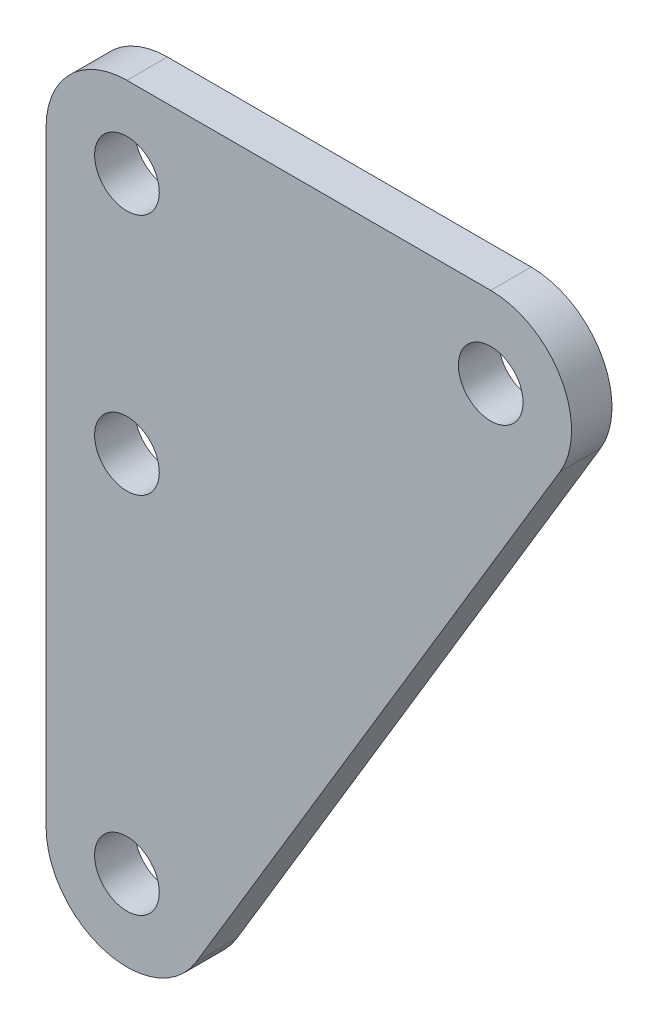
ISO-10303-21;
HEADER;
FILE_DESCRIPTION(('STEP AP214'),'2;1');
FILE_NAME('part.step','',(''),(''),'','','');
FILE_SCHEMA(('AUTOMOTIVE_DESIGN { 1 0 10303 214 1 1 1 1 }'));
ENDSEC;
DATA;
#1=APPLICATION_CONTEXT('core data for automotive mechanical design processes');
#2=APPLICATION_PROTOCOL_DEFINITION('international standard','automotive_design',2000,#1);
#3=PRODUCT_CONTEXT('',#1,'mechanical');
#4=PRODUCT('Part','Part','',(#3));
#5=PRODUCT_RELATED_PRODUCT_CATEGORY('part','',(#4));
#6=PRODUCT_DEFINITION_FORMATION('','',#4);
#7=PRODUCT_DEFINITION_CONTEXT('part definition',#1,'design');
#8=PRODUCT_DEFINITION('design','',#6,#7);
#9=PRODUCT_DEFINITION_SHAPE('','',#8);
#10=(LENGTH_UNIT() NAMED_UNIT(*) SI_UNIT(.MILLI.,.METRE.));
#11=(NAMED_UNIT(*) PLANE_ANGLE_UNIT() SI_UNIT($,.RADIAN.));
#12=(NAMED_UNIT(*) SI_UNIT($,.STERADIAN.) SOLID_ANGLE_UNIT());
#13=UNCERTAINTY_MEASURE_WITH_UNIT(LENGTH_MEASURE(1.E-05),#10,'distance_accuracy_value','');
#14=(GEOMETRIC_REPRESENTATION_CONTEXT(3) GLOBAL_UNCERTAINTY_ASSIGNED_CONTEXT((#13)) GLOBAL_UNIT_ASSIGNED_CONTEXT((#10,
#11,#12)) REPRESENTATION_CONTEXT('',''));
#15=CARTESIAN_POINT('',(0.,0.,0.));
#16=DIRECTION('',(0.,0.,1.));
#17=DIRECTION('',(1.,0.,0.));
#18=AXIS2_PLACEMENT_3D('',#15,#16,#17);
#19=CARTESIAN_POINT('',(0.,30.,5.));
#20=DIRECTION('',(0.,0.,-1.));
#21=DIRECTION('',(-1.,0.,0.));
#22=AXIS2_PLACEMENT_3D('',#19,#20,#21);
#23=PLANE('',#22);
#24=CARTESIAN_POINT('',(0.,30.,5.));
#25=DIRECTION('',(0.,0.,1.));
#26=DIRECTION('',(-1.,0.,0.));
#27=AXIS2_PLACEMENT_3D('',#24,#25,#26);
#28=CIRCLE('',#27,9.99999999999998);
#29=CARTESIAN_POINT('',(0.,40.,5.));
#30=VERTEX_POINT('',#29);
#31=CARTESIAN_POINT('',(-9.99999999999999,30.,5.));
#32=VERTEX_POINT('',#31);
#33=EDGE_CURVE('E131',#30,#32,#28,.T.);
#34=ORIENTED_EDGE('',*,*,#33,.T.);
#35=DIRECTION('',(0.,-1.,0.));
#36=VECTOR('',#35,1.);
#37=CARTESIAN_POINT('',(-9.99999999999999,-45.,5.));
#38=LINE('',#37,#36);
#39=CARTESIAN_POINT('',(-9.99999999999999,-45.,5.));
#40=VERTEX_POINT('',#39);
#41=EDGE_CURVE('E89',#32,#40,#38,.T.);
#42=ORIENTED_EDGE('',*,*,#41,.T.);
#43=CARTESIAN_POINT('',(0.,-45.,5.));
#44=DIRECTION('',(0.,0.,1.));
#45=DIRECTION('',(-1.,0.,0.));
#46=AXIS2_PLACEMENT_3D('',#43,#44,#45);
#47=CIRCLE('',#46,9.99999999999999);
#48=CARTESIAN_POINT('',(8.57492925712544,-50.1449575542753,5.));
#49=VERTEX_POINT('',#48);
#50=EDGE_CURVE('E102',#40,#49,#47,.T.);
#51=ORIENTED_EDGE('',*,*,#50,.T.);
#52=DIRECTION('',(0.514495755427527,0.857492925712544,0.));
#53=VECTOR('',#52,1.);
#54=CARTESIAN_POINT('',(53.5749292571254,24.8550424457247,5.));
#55=LINE('',#54,#53);
#56=CARTESIAN_POINT('',(53.5749292571254,24.8550424457247,5.));
#57=VERTEX_POINT('',#56);
#58=EDGE_CURVE('E96',#49,#57,#55,.T.);
#59=ORIENTED_EDGE('',*,*,#58,.T.);
#60=CARTESIAN_POINT('',(45.,30.,5.));
#61=DIRECTION('',(0.,0.,1.));
#62=DIRECTION('',(-1.,0.,0.));
#63=AXIS2_PLACEMENT_3D('',#60,#61,#62);
#64=CIRCLE('',#63,10.);
#65=CARTESIAN_POINT('',(45.,40.,5.));
#66=VERTEX_POINT('',#65);
#67=EDGE_CURVE('E100',#57,#66,#64,.T.);
#68=ORIENTED_EDGE('',*,*,#67,.T.);
#69=DIRECTION('',(-1.,0.,0.));
#70=VECTOR('',#69,1.);
#71=CARTESIAN_POINT('',(0.,40.,5.));
#72=LINE('',#71,#70);
#73=EDGE_CURVE('E52',#66,#30,#72,.T.);
#74=ORIENTED_EDGE('',*,*,#73,.T.);
#75=EDGE_LOOP('',(#34,#42,#51,#59,#68,#74));
#76=FACE_BOUND('',#75,.T.);
#77=CARTESIAN_POINT('',(0.,0.,5.));
#78=DIRECTION('',(0.,0.,1.));
#79=DIRECTION('',(1.,0.,0.));
#80=AXIS2_PLACEMENT_3D('',#77,#78,#79);
#81=CIRCLE('',#80,4.);
#82=CARTESIAN_POINT('',(4.,0.,5.));
#83=VERTEX_POINT('',#82);
#84=EDGE_CURVE('E124',#83,#83,#81,.T.);
#85=ORIENTED_EDGE('',*,*,#84,.F.);
#86=EDGE_LOOP('',(#85));
#87=FACE_BOUND('',#86,.T.);
#88=CARTESIAN_POINT('',(0.,-45.,5.));
#89=DIRECTION('',(0.,0.,1.));
#90=DIRECTION('',(1.,0.,0.));
#91=AXIS2_PLACEMENT_3D('',#88,#89,#90);
#92=CIRCLE('',#91,4.);
#93=CARTESIAN_POINT('',(4.,-45.,5.));
#94=VERTEX_POINT('',#93);
#95=EDGE_CURVE('E195',#94,#94,#92,.T.);
#96=ORIENTED_EDGE('',*,*,#95,.F.);
#97=EDGE_LOOP('',(#96));
#98=FACE_BOUND('',#97,.T.);
#99=CARTESIAN_POINT('',(0.,30.,5.));
#100=DIRECTION('',(0.,0.,1.));
#101=DIRECTION('',(1.,0.,0.));
#102=AXIS2_PLACEMENT_3D('',#99,#100,#101);
#103=CIRCLE('',#102,4.);
#104=CARTESIAN_POINT('',(4.,30.,5.));
#105=VERTEX_POINT('',#104);
#106=EDGE_CURVE('E189',#105,#105,#103,.T.);
#107=ORIENTED_EDGE('',*,*,#106,.F.);
#108=EDGE_LOOP('',(#107));
#109=FACE_BOUND('',#108,.T.);
#110=CARTESIAN_POINT('',(45.,30.,5.));
#111=DIRECTION('',(0.,0.,1.));
#112=DIRECTION('',(1.,0.,0.));
#113=AXIS2_PLACEMENT_3D('',#110,#111,#112);
#114=CIRCLE('',#113,4.00000000000001);
#115=CARTESIAN_POINT('',(49.,30.,5.));
#116=VERTEX_POINT('',#115);
#117=EDGE_CURVE('E180',#116,#116,#114,.T.);
#118=ORIENTED_EDGE('',*,*,#117,.F.);
#119=EDGE_LOOP('',(#118));
#120=FACE_BOUND('',#119,.T.);
#121=ADVANCED_FACE('F35',(#76,#87,#98,#109,#120),#23,.F.);
#122=CARTESIAN_POINT('',(0.,30.,0.));
#123=DIRECTION('',(0.,0.,-1.));
#124=DIRECTION('',(-1.,0.,0.));
#125=AXIS2_PLACEMENT_3D('',#122,#123,#124);
#126=PLANE('',#125);
#127=CARTESIAN_POINT('',(0.,30.,0.));
#128=DIRECTION('',(0.,0.,1.));
#129=DIRECTION('',(1.,0.,0.));
#130=AXIS2_PLACEMENT_3D('',#127,#128,#129);
#131=CIRCLE('',#130,4.);
#132=CARTESIAN_POINT('',(4.,30.,0.));
#133=VERTEX_POINT('',#132);
#134=EDGE_CURVE('E186',#133,#133,#131,.T.);
#135=ORIENTED_EDGE('',*,*,#134,.T.);
#136=EDGE_LOOP('',(#135));
#137=FACE_BOUND('',#136,.T.);
#138=CARTESIAN_POINT('',(0.,0.,0.));
#139=DIRECTION('',(0.,0.,1.));
#140=DIRECTION('',(1.,0.,0.));
#141=AXIS2_PLACEMENT_3D('',#138,#139,#140);
#142=CIRCLE('',#141,4.);
#143=CARTESIAN_POINT('',(4.,0.,0.));
#144=VERTEX_POINT('',#143);
#145=EDGE_CURVE('E198',#144,#144,#142,.T.);
#146=ORIENTED_EDGE('',*,*,#145,.T.);
#147=EDGE_LOOP('',(#146));
#148=FACE_BOUND('',#147,.T.);
#149=CARTESIAN_POINT('',(0.,30.,0.));
#150=DIRECTION('',(0.,0.,1.));
#151=DIRECTION('',(-1.,0.,0.));
#152=AXIS2_PLACEMENT_3D('',#149,#150,#151);
#153=CIRCLE('',#152,9.99999999999998);
#154=CARTESIAN_POINT('',(0.,40.,0.));
#155=VERTEX_POINT('',#154);
#156=CARTESIAN_POINT('',(-9.99999999999999,30.,0.));
#157=VERTEX_POINT('',#156);
#158=EDGE_CURVE('E120',#155,#157,#153,.T.);
#159=ORIENTED_EDGE('',*,*,#158,.F.);
#160=DIRECTION('',(-1.,0.,0.));
#161=VECTOR('',#160,1.);
#162=CARTESIAN_POINT('',(0.,40.,0.));
#163=LINE('',#162,#161);
#164=CARTESIAN_POINT('',(45.,40.,0.));
#165=VERTEX_POINT('',#164);
#166=EDGE_CURVE('E81',#165,#155,#163,.T.);
#167=ORIENTED_EDGE('',*,*,#166,.F.);
#168=CARTESIAN_POINT('',(45.,30.,0.));
#169=DIRECTION('',(0.,0.,1.));
#170=DIRECTION('',(-1.,0.,0.));
#171=AXIS2_PLACEMENT_3D('',#168,#169,#170);
#172=CIRCLE('',#171,10.);
#173=CARTESIAN_POINT('',(53.5749292571254,24.8550424457247,0.));
#174=VERTEX_POINT('',#173);
#175=EDGE_CURVE('E75',#174,#165,#172,.T.);
#176=ORIENTED_EDGE('',*,*,#175,.F.);
#177=DIRECTION('',(0.514495755427527,0.857492925712544,0.));
#178=VECTOR('',#177,1.);
#179=CARTESIAN_POINT('',(53.5749292571254,24.8550424457247,0.));
#180=LINE('',#179,#178);
#181=CARTESIAN_POINT('',(8.57492925712544,-50.1449575542753,0.));
#182=VERTEX_POINT('',#181);
#183=EDGE_CURVE('E110',#182,#174,#180,.T.);
#184=ORIENTED_EDGE('',*,*,#183,.F.);
#185=CARTESIAN_POINT('',(0.,-45.,0.));
#186=DIRECTION('',(0.,0.,1.));
#187=DIRECTION('',(-1.,0.,0.));
#188=AXIS2_PLACEMENT_3D('',#185,#186,#187);
#189=CIRCLE('',#188,9.99999999999999);
#190=CARTESIAN_POINT('',(-9.99999999999999,-45.,0.));
#191=VERTEX_POINT('',#190);
#192=EDGE_CURVE('E126',#191,#182,#189,.T.);
#193=ORIENTED_EDGE('',*,*,#192,.F.);
#194=DIRECTION('',(0.,-1.,0.));
#195=VECTOR('',#194,1.);
#196=CARTESIAN_POINT('',(-9.99999999999999,-45.,0.));
#197=LINE('',#196,#195);
#198=EDGE_CURVE('E123',#157,#191,#197,.T.);
#199=ORIENTED_EDGE('',*,*,#198,.F.);
#200=EDGE_LOOP('',(#159,#167,#176,#184,#193,#199));
#201=FACE_BOUND('',#200,.T.);
#202=CARTESIAN_POINT('',(0.,-45.,0.));
#203=DIRECTION('',(0.,0.,1.));
#204=DIRECTION('',(1.,0.,0.));
#205=AXIS2_PLACEMENT_3D('',#202,#203,#204);
#206=CIRCLE('',#205,4.);
#207=CARTESIAN_POINT('',(4.,-45.,0.));
#208=VERTEX_POINT('',#207);
#209=EDGE_CURVE('E192',#208,#208,#206,.T.);
#210=ORIENTED_EDGE('',*,*,#209,.T.);
#211=EDGE_LOOP('',(#210));
#212=FACE_BOUND('',#211,.T.);
#213=CARTESIAN_POINT('',(45.,30.,0.));
#214=DIRECTION('',(0.,0.,1.));
#215=DIRECTION('',(1.,0.,0.));
#216=AXIS2_PLACEMENT_3D('',#213,#214,#215);
#217=CIRCLE('',#216,4.00000000000001);
#218=CARTESIAN_POINT('',(49.,30.,0.));
#219=VERTEX_POINT('',#218);
#220=EDGE_CURVE('E183',#219,#219,#217,.T.);
#221=ORIENTED_EDGE('',*,*,#220,.T.);
#222=EDGE_LOOP('',(#221));
#223=FACE_BOUND('',#222,.T.);
#224=ADVANCED_FACE('F140',(#137,#148,#201,#212,#223),#126,.T.);
#225=CARTESIAN_POINT('',(0.,30.,5.));
#226=DIRECTION('',(0.,0.,-1.));
#227=DIRECTION('',(-1.,0.,0.));
#228=AXIS2_PLACEMENT_3D('',#225,#226,#227);
#229=CYLINDRICAL_SURFACE('',#228,9.99999999999998);
#230=ORIENTED_EDGE('',*,*,#158,.T.);
#231=DIRECTION('',(0.,0.,-1.));
#232=VECTOR('',#231,1.);
#233=CARTESIAN_POINT('',(-9.99999999999999,30.,5.));
#234=LINE('',#233,#232);
#235=EDGE_CURVE('E11',#32,#157,#234,.T.);
#236=ORIENTED_EDGE('',*,*,#235,.F.);
#237=ORIENTED_EDGE('',*,*,#33,.F.);
#238=DIRECTION('',(0.,0.,-1.));
#239=VECTOR('',#238,1.);
#240=CARTESIAN_POINT('',(0.,40.,5.));
#241=LINE('',#240,#239);
#242=EDGE_CURVE('E116',#30,#155,#241,.T.);
#243=ORIENTED_EDGE('',*,*,#242,.T.);
#244=EDGE_LOOP('',(#230,#236,#237,#243));
#245=FACE_BOUND('',#244,.T.);
#246=ADVANCED_FACE('F37',(#245),#229,.T.);
#247=CARTESIAN_POINT('',(-9.99999999999999,-45.,5.));
#248=DIRECTION('',(1.,0.,0.));
#249=DIRECTION('',(0.,0.,-1.));
#250=AXIS2_PLACEMENT_3D('',#247,#248,#249);
#251=PLANE('',#250);
#252=ORIENTED_EDGE('',*,*,#198,.T.);
#253=DIRECTION('',(0.,0.,-1.));
#254=VECTOR('',#253,1.);
#255=CARTESIAN_POINT('',(-9.99999999999999,-45.,5.));
#256=LINE('',#255,#254);
#257=EDGE_CURVE('E44',#40,#191,#256,.T.);
#258=ORIENTED_EDGE('',*,*,#257,.F.);
#259=ORIENTED_EDGE('',*,*,#41,.F.);
#260=ORIENTED_EDGE('',*,*,#235,.T.);
#261=EDGE_LOOP('',(#252,#258,#259,#260));
#262=FACE_BOUND('',#261,.T.);
#263=ADVANCED_FACE('F258',(#262),#251,.F.);
#264=CARTESIAN_POINT('',(0.,-45.,5.));
#265=DIRECTION('',(0.,0.,-1.));
#266=DIRECTION('',(-1.,0.,0.));
#267=AXIS2_PLACEMENT_3D('',#264,#265,#266);
#268=CYLINDRICAL_SURFACE('',#267,9.99999999999999);
#269=ORIENTED_EDGE('',*,*,#192,.T.);
#270=DIRECTION('',(0.,0.,-1.));
#271=VECTOR('',#270,1.);
#272=CARTESIAN_POINT('',(8.57492925712544,-50.1449575542753,5.));
#273=LINE('',#272,#271);
#274=EDGE_CURVE('E111',#49,#182,#273,.T.);
#275=ORIENTED_EDGE('',*,*,#274,.F.);
#276=ORIENTED_EDGE('',*,*,#50,.F.);
#277=ORIENTED_EDGE('',*,*,#257,.T.);
#278=EDGE_LOOP('',(#269,#275,#276,#277));
#279=FACE_BOUND('',#278,.T.);
#280=ADVANCED_FACE('F137',(#279),#268,.T.);
#281=CARTESIAN_POINT('',(53.5749292571254,24.8550424457247,5.));
#282=DIRECTION('',(-0.857492925712544,0.514495755427527,0.));
#283=DIRECTION('',(-0.514495755427527,-0.857492925712544,0.));
#284=AXIS2_PLACEMENT_3D('',#281,#282,#283);
#285=PLANE('',#284);
#286=ORIENTED_EDGE('',*,*,#183,.T.);
#287=DIRECTION('',(0.,0.,-1.));
#288=VECTOR('',#287,1.);
#289=CARTESIAN_POINT('',(53.5749292571254,24.8550424457247,5.));
#290=LINE('',#289,#288);
#291=EDGE_CURVE('E107',#57,#174,#290,.T.);
#292=ORIENTED_EDGE('',*,*,#291,.F.);
#293=ORIENTED_EDGE('',*,*,#58,.F.);
#294=ORIENTED_EDGE('',*,*,#274,.T.);
#295=EDGE_LOOP('',(#286,#292,#293,#294));
#296=FACE_BOUND('',#295,.T.);
#297=ADVANCED_FACE('F108',(#296),#285,.F.);
#298=CARTESIAN_POINT('',(45.,30.,5.));
#299=DIRECTION('',(0.,0.,-1.));
#300=DIRECTION('',(-1.,0.,0.));
#301=AXIS2_PLACEMENT_3D('',#298,#299,#300);
#302=CYLINDRICAL_SURFACE('',#301,10.);
#303=ORIENTED_EDGE('',*,*,#175,.T.);
#304=DIRECTION('',(0.,0.,-1.));
#305=VECTOR('',#304,1.);
#306=CARTESIAN_POINT('',(45.,40.,5.));
#307=LINE('',#306,#305);
#308=EDGE_CURVE('E112',#66,#165,#307,.T.);
#309=ORIENTED_EDGE('',*,*,#308,.F.);
#310=ORIENTED_EDGE('',*,*,#67,.F.);
#311=ORIENTED_EDGE('',*,*,#291,.T.);
#312=EDGE_LOOP('',(#303,#309,#310,#311));
#313=FACE_BOUND('',#312,.T.);
#314=ADVANCED_FACE('F114',(#313),#302,.T.);
#315=CARTESIAN_POINT('',(0.,40.,5.));
#316=DIRECTION('',(0.,-1.,0.));
#317=DIRECTION('',(1.,0.,0.));
#318=AXIS2_PLACEMENT_3D('',#315,#316,#317);
#319=PLANE('',#318);
#320=ORIENTED_EDGE('',*,*,#166,.T.);
#321=ORIENTED_EDGE('',*,*,#242,.F.);
#322=ORIENTED_EDGE('',*,*,#73,.F.);
#323=ORIENTED_EDGE('',*,*,#308,.T.);
#324=EDGE_LOOP('',(#320,#321,#322,#323));
#325=FACE_BOUND('',#324,.T.);
#326=ADVANCED_FACE('F145',(#325),#319,.F.);
#327=CARTESIAN_POINT('',(0.,0.,5.));
#328=DIRECTION('',(0.,0.,-1.));
#329=DIRECTION('',(-1.,0.,0.));
#330=AXIS2_PLACEMENT_3D('',#327,#328,#329);
#331=CYLINDRICAL_SURFACE('',#330,4.);
#332=ORIENTED_EDGE('',*,*,#84,.T.);
#333=EDGE_LOOP('',(#332));
#334=FACE_BOUND('',#333,.T.);
#335=ORIENTED_EDGE('',*,*,#145,.F.);
#336=EDGE_LOOP('',(#335));
#337=FACE_BOUND('',#336,.T.);
#338=ADVANCED_FACE('F147',(#334,#337),#331,.F.);
#339=CARTESIAN_POINT('',(0.,-45.,5.));
#340=DIRECTION('',(0.,0.,-1.));
#341=DIRECTION('',(-1.,0.,0.));
#342=AXIS2_PLACEMENT_3D('',#339,#340,#341);
#343=CYLINDRICAL_SURFACE('',#342,4.);
#344=ORIENTED_EDGE('',*,*,#95,.T.);
#345=EDGE_LOOP('',(#344));
#346=FACE_BOUND('',#345,.T.);
#347=ORIENTED_EDGE('',*,*,#209,.F.);
#348=EDGE_LOOP('',(#347));
#349=FACE_BOUND('',#348,.T.);
#350=ADVANCED_FACE('F153',(#346,#349),#343,.F.);
#351=CARTESIAN_POINT('',(0.,30.,5.));
#352=DIRECTION('',(0.,0.,-1.));
#353=DIRECTION('',(-1.,0.,0.));
#354=AXIS2_PLACEMENT_3D('',#351,#352,#353);
#355=CYLINDRICAL_SURFACE('',#354,4.);
#356=ORIENTED_EDGE('',*,*,#106,.T.);
#357=EDGE_LOOP('',(#356));
#358=FACE_BOUND('',#357,.T.);
#359=ORIENTED_EDGE('',*,*,#134,.F.);
#360=EDGE_LOOP('',(#359));
#361=FACE_BOUND('',#360,.T.);
#362=ADVANCED_FACE('F167',(#358,#361),#355,.F.);
#363=CARTESIAN_POINT('',(45.,30.,5.));
#364=DIRECTION('',(0.,0.,-1.));
#365=DIRECTION('',(-1.,0.,0.));
#366=AXIS2_PLACEMENT_3D('',#363,#364,#365);
#367=CYLINDRICAL_SURFACE('',#366,4.00000000000001);
#368=ORIENTED_EDGE('',*,*,#117,.T.);
#369=EDGE_LOOP('',(#368));
#370=FACE_BOUND('',#369,.T.);
#371=ORIENTED_EDGE('',*,*,#220,.F.);
#372=EDGE_LOOP('',(#371));
#373=FACE_BOUND('',#372,.T.);
#374=ADVANCED_FACE('F171',(#370,#373),#367,.F.);
#375=CLOSED_SHELL('',(#121,#224,#246,#263,#280,#297,#314,#326,#338,#350,#362,#374));
#376=MANIFOLD_SOLID_BREP('B2',#375);
#377=ADVANCED_BREP_SHAPE_REPRESENTATION('',(#18,#376),#14);
#378=SHAPE_DEFINITION_REPRESENTATION(#9,#377);
ENDSEC;
END-ISO-10303-21;
